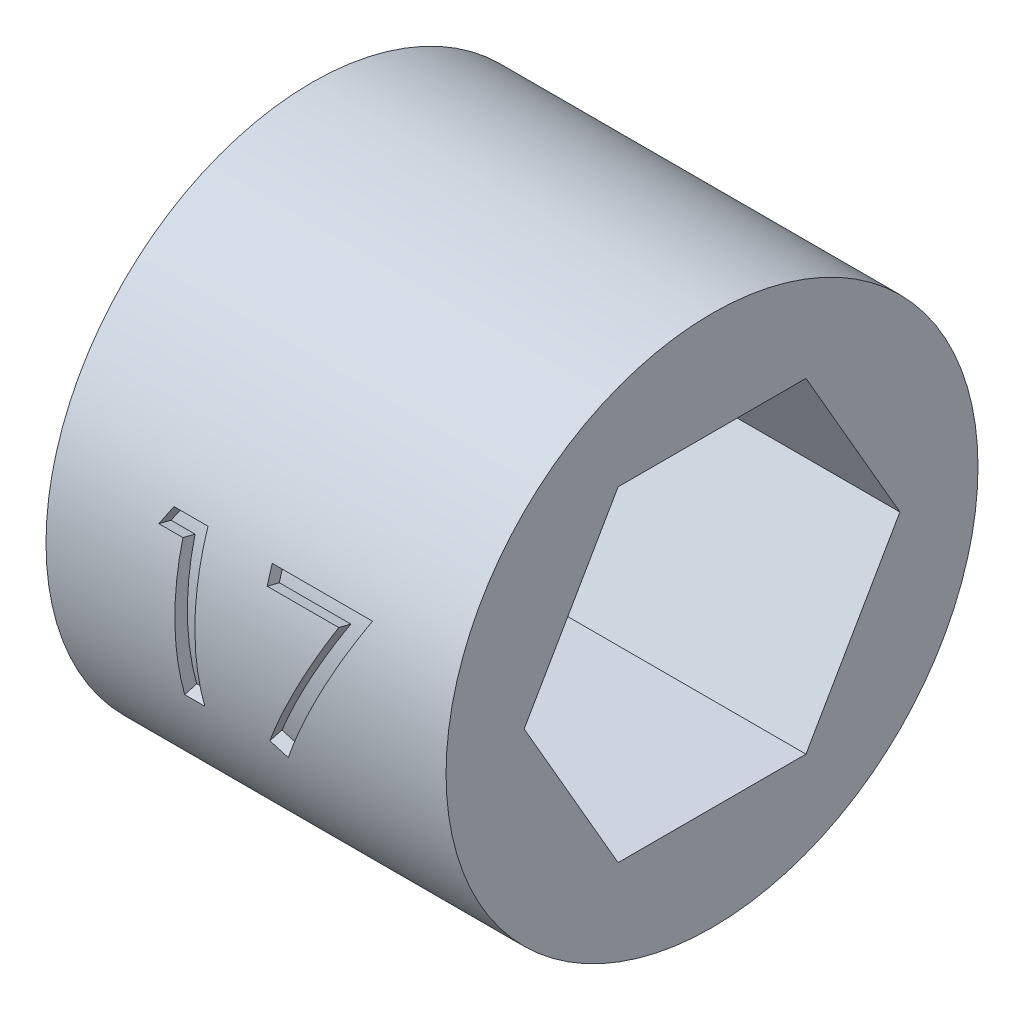
ISO-10303-21;
HEADER;
FILE_DESCRIPTION(('STEP AP214'),'2;1');
FILE_NAME('part.step','',(''),(''),'','','');
FILE_SCHEMA(('AUTOMOTIVE_DESIGN { 1 0 10303 214 1 1 1 1 }'));
ENDSEC;
DATA;
#1=APPLICATION_CONTEXT('core data for automotive mechanical design processes');
#2=APPLICATION_PROTOCOL_DEFINITION('international standard','automotive_design',2000,#1);
#3=PRODUCT_CONTEXT('',#1,'mechanical');
#4=PRODUCT('Part','Part','',(#3));
#5=PRODUCT_RELATED_PRODUCT_CATEGORY('part','',(#4));
#6=PRODUCT_DEFINITION_FORMATION('','',#4);
#7=PRODUCT_DEFINITION_CONTEXT('part definition',#1,'design');
#8=PRODUCT_DEFINITION('design','',#6,#7);
#9=PRODUCT_DEFINITION_SHAPE('','',#8);
#10=(LENGTH_UNIT() NAMED_UNIT(*) SI_UNIT(.MILLI.,.METRE.));
#11=(NAMED_UNIT(*) PLANE_ANGLE_UNIT() SI_UNIT($,.RADIAN.));
#12=(NAMED_UNIT(*) SI_UNIT($,.STERADIAN.) SOLID_ANGLE_UNIT());
#13=UNCERTAINTY_MEASURE_WITH_UNIT(LENGTH_MEASURE(1.E-05),#10,'distance_accuracy_value','');
#14=(GEOMETRIC_REPRESENTATION_CONTEXT(3) GLOBAL_UNCERTAINTY_ASSIGNED_CONTEXT((#13)) GLOBAL_UNIT_ASSIGNED_CONTEXT((#10,
#11,#12)) REPRESENTATION_CONTEXT('',''));
#15=CARTESIAN_POINT('',(0.,0.,0.));
#16=DIRECTION('',(0.,0.,1.));
#17=DIRECTION('',(1.,0.,0.));
#18=AXIS2_PLACEMENT_3D('',#15,#16,#17);
#19=CARTESIAN_POINT('',(16.23749991,0.,0.));
#20=DIRECTION('',(1.,0.,0.));
#21=DIRECTION('',(0.,0.,-1.));
#22=AXIS2_PLACEMENT_3D('',#19,#20,#21);
#23=PLANE('',#22);
#24=CARTESIAN_POINT('',(16.23749991,0.,0.));
#25=DIRECTION('',(1.,0.,0.));
#26=DIRECTION('',(0.,0.,-1.));
#27=AXIS2_PLACEMENT_3D('',#24,#25,#26);
#28=CIRCLE('',#27,10.795);
#29=CARTESIAN_POINT('',(16.23749991,0.,-10.795));
#30=VERTEX_POINT('',#29);
#31=EDGE_CURVE('E13',#30,#30,#28,.T.);
#32=ORIENTED_EDGE('',*,*,#31,.T.);
#33=EDGE_LOOP('',(#32));
#34=FACE_BOUND('',#33,.T.);
#35=DIRECTION('',(0.,0.866025403784438,0.500000000000001));
#36=VECTOR('',#35,1.);
#37=CARTESIAN_POINT('',(16.23749991,0.,-7.62564235545655));
#38=LINE('',#37,#36);
#39=CARTESIAN_POINT('',(16.23749991,0.,-7.62564235545655));
#40=VERTEX_POINT('',#39);
#41=CARTESIAN_POINT('',(16.23749991,6.60399999999998,-3.81282117772826));
#42=VERTEX_POINT('',#41);
#43=EDGE_CURVE('E691',#40,#42,#38,.T.);
#44=ORIENTED_EDGE('',*,*,#43,.F.);
#45=DIRECTION('',(0.,0.866025403784441,-0.499999999999995));
#46=VECTOR('',#45,1.);
#47=CARTESIAN_POINT('',(16.23749991,-6.60399999999993,-3.81282117772835));
#48=LINE('',#47,#46);
#49=CARTESIAN_POINT('',(16.23749991,-6.60399999999993,-3.81282117772835));
#50=VERTEX_POINT('',#49);
#51=EDGE_CURVE('E668',#50,#40,#48,.T.);
#52=ORIENTED_EDGE('',*,*,#51,.F.);
#53=DIRECTION('',(0.,0.,-1.));
#54=VECTOR('',#53,1.);
#55=CARTESIAN_POINT('',(16.23749991,-6.60400000000001,3.81282117772821));
#56=LINE('',#55,#54);
#57=CARTESIAN_POINT('',(16.23749991,-6.60400000000001,3.81282117772821));
#58=VERTEX_POINT('',#57);
#59=EDGE_CURVE('E664',#58,#50,#56,.T.);
#60=ORIENTED_EDGE('',*,*,#59,.F.);
#61=DIRECTION('',(0.,-0.866025403784435,-0.500000000000007));
#62=VECTOR('',#61,1.);
#63=CARTESIAN_POINT('',(16.23749991,0.,7.62564235545655));
#64=LINE('',#63,#62);
#65=CARTESIAN_POINT('',(16.23749991,0.,7.62564235545655));
#66=VERTEX_POINT('',#65);
#67=EDGE_CURVE('E684',#66,#58,#64,.T.);
#68=ORIENTED_EDGE('',*,*,#67,.F.);
#69=DIRECTION('',(0.,-0.866025403784441,0.499999999999995));
#70=VECTOR('',#69,1.);
#71=CARTESIAN_POINT('',(16.23749991,6.60399999999996,3.8128211777283));
#72=LINE('',#71,#70);
#73=CARTESIAN_POINT('',(16.23749991,6.60399999999996,3.8128211777283));
#74=VERTEX_POINT('',#73);
#75=EDGE_CURVE('E687',#74,#66,#72,.T.);
#76=ORIENTED_EDGE('',*,*,#75,.F.);
#77=DIRECTION('',(0.,0.,1.));
#78=VECTOR('',#77,1.);
#79=CARTESIAN_POINT('',(16.23749991,6.60399999999998,-3.81282117772826));
#80=LINE('',#79,#78);
#81=EDGE_CURVE('E689',#42,#74,#80,.T.);
#82=ORIENTED_EDGE('',*,*,#81,.F.);
#83=EDGE_LOOP('',(#44,#52,#60,#68,#76,#82));
#84=FACE_BOUND('',#83,.T.);
#85=ADVANCED_FACE('F363',(#34,#84),#23,.T.);
#86=CARTESIAN_POINT('',(0.,0.,0.));
#87=DIRECTION('',(1.,0.,0.));
#88=DIRECTION('',(0.,0.,-1.));
#89=AXIS2_PLACEMENT_3D('',#86,#87,#88);
#90=PLANE('',#89);
#91=CARTESIAN_POINT('',(0.,0.,0.));
#92=DIRECTION('',(1.,0.,0.));
#93=DIRECTION('',(0.,0.,-1.));
#94=AXIS2_PLACEMENT_3D('',#91,#92,#93);
#95=CIRCLE('',#94,10.795);
#96=CARTESIAN_POINT('',(0.,0.,-10.795));
#97=VERTEX_POINT('',#96);
#98=EDGE_CURVE('E374',#97,#97,#95,.T.);
#99=ORIENTED_EDGE('',*,*,#98,.F.);
#100=EDGE_LOOP('',(#99));
#101=FACE_BOUND('',#100,.T.);
#102=DIRECTION('',(0.,0.866025403784441,-0.499999999999995));
#103=VECTOR('',#102,1.);
#104=CARTESIAN_POINT('',(0.,-6.60399999999993,-3.81282117772835));
#105=LINE('',#104,#103);
#106=CARTESIAN_POINT('',(0.,-6.60399999999993,-3.81282117772835));
#107=VERTEX_POINT('',#106);
#108=CARTESIAN_POINT('',(0.,0.,-7.62564235545655));
#109=VERTEX_POINT('',#108);
#110=EDGE_CURVE('E509',#107,#109,#105,.T.);
#111=ORIENTED_EDGE('',*,*,#110,.T.);
#112=DIRECTION('',(0.,0.866025403784438,0.500000000000001));
#113=VECTOR('',#112,1.);
#114=CARTESIAN_POINT('',(0.,0.,-7.62564235545655));
#115=LINE('',#114,#113);
#116=CARTESIAN_POINT('',(0.,6.60399999999998,-3.81282117772826));
#117=VERTEX_POINT('',#116);
#118=EDGE_CURVE('E678',#109,#117,#115,.T.);
#119=ORIENTED_EDGE('',*,*,#118,.T.);
#120=DIRECTION('',(0.,0.,1.));
#121=VECTOR('',#120,1.);
#122=CARTESIAN_POINT('',(0.,6.60399999999998,-3.81282117772826));
#123=LINE('',#122,#121);
#124=CARTESIAN_POINT('',(0.,6.60399999999996,3.8128211777283));
#125=VERTEX_POINT('',#124);
#126=EDGE_CURVE('E675',#117,#125,#123,.T.);
#127=ORIENTED_EDGE('',*,*,#126,.T.);
#128=DIRECTION('',(0.,-0.866025403784441,0.499999999999995));
#129=VECTOR('',#128,1.);
#130=CARTESIAN_POINT('',(0.,6.60399999999996,3.8128211777283));
#131=LINE('',#130,#129);
#132=CARTESIAN_POINT('',(0.,0.,7.62564235545655));
#133=VERTEX_POINT('',#132);
#134=EDGE_CURVE('E672',#125,#133,#131,.T.);
#135=ORIENTED_EDGE('',*,*,#134,.T.);
#136=DIRECTION('',(0.,-0.866025403784435,-0.500000000000007));
#137=VECTOR('',#136,1.);
#138=CARTESIAN_POINT('',(0.,0.,7.62564235545655));
#139=LINE('',#138,#137);
#140=CARTESIAN_POINT('',(0.,-6.60400000000001,3.81282117772821));
#141=VERTEX_POINT('',#140);
#142=EDGE_CURVE('E669',#133,#141,#139,.T.);
#143=ORIENTED_EDGE('',*,*,#142,.T.);
#144=DIRECTION('',(0.,0.,-1.));
#145=VECTOR('',#144,1.);
#146=CARTESIAN_POINT('',(0.,-6.60400000000001,3.81282117772821));
#147=LINE('',#146,#145);
#148=EDGE_CURVE('E665',#141,#107,#147,.T.);
#149=ORIENTED_EDGE('',*,*,#148,.T.);
#150=EDGE_LOOP('',(#111,#119,#127,#135,#143,#149));
#151=FACE_BOUND('',#150,.T.);
#152=ADVANCED_FACE('F1330',(#101,#151),#90,.F.);
#153=CARTESIAN_POINT('',(16.23749991,0.,0.));
#154=DIRECTION('',(-1.,0.,0.));
#155=DIRECTION('',(0.,0.,1.));
#156=AXIS2_PLACEMENT_3D('',#153,#154,#155);
#157=CYLINDRICAL_SURFACE('',#156,10.795);
#158=CARTESIAN_POINT('',(6.04317977266915,3.34799785215524,10.2626963017505));
#159=CARTESIAN_POINT('',(5.58270563876344,3.34798552404855,10.2627003235469));
#160=CARTESIAN_POINT('',(5.12223150485772,3.34797319593462,10.262704345321));
#161=CARTESIAN_POINT('',(4.66175737095201,3.34796086781344,10.262708367073));
#162=B_SPLINE_CURVE_WITH_KNOTS('',3,(#158,#159,#160,#161),.UNSPECIFIED.,.F.,.F.,(4,4),(0.,
0.99999963804209),.UNSPECIFIED.);
#163=CARTESIAN_POINT('',(6.04317977266915,3.34799785215524,10.2626963017505));
#164=VERTEX_POINT('',#163);
#165=CARTESIAN_POINT('',(4.66175687093506,3.34796086780005,10.2627083670774));
#166=VERTEX_POINT('',#165);
#167=EDGE_CURVE('E527',#164,#166,#162,.T.);
#168=ORIENTED_EDGE('',*,*,#167,.F.);
#169=CARTESIAN_POINT('',(6.04317167885554,-2.91281495669229,10.3945915758182));
#170=CARTESIAN_POINT('',(6.04317167885554,-1.37194914945548,10.8263792931938));
#171=CARTESIAN_POINT('',(6.04317167885554,0.227365625654538,10.7926053329245));
#172=CARTESIAN_POINT('',(6.04317167885554,1.82721819927044,10.7588200155505));
#173=CARTESIAN_POINT('',(6.04317167885554,3.34799784702387,10.2626963034245));
#174=B_SPLINE_CURVE_WITH_KNOTS('',2,(#169,#170,#171,#172,#173),.UNSPECIFIED.,.F.,.F.,(3,2,3),
(0.,0.5,1.),.UNSPECIFIED.);
#175=CARTESIAN_POINT('',(6.04317167885554,-2.91281495669229,10.3945915758182));
#176=VERTEX_POINT('',#175);
#177=EDGE_CURVE('E499',#176,#164,#174,.T.);
#178=ORIENTED_EDGE('',*,*,#177,.F.);
#179=CARTESIAN_POINT('',(5.22907354558086,-2.91281746579775,10.3945908727057));
#180=DIRECTION('',(1.,0.,0.));
#181=VECTOR('',#180,1.);
#182=LINE('',#179,#181);
#183=CARTESIAN_POINT('',(5.22907354558086,-2.91281746579783,10.394590872706));
#184=VERTEX_POINT('',#183);
#185=EDGE_CURVE('E514',#184,#176,#182,.T.);
#186=ORIENTED_EDGE('',*,*,#185,.F.);
#187=CARTESIAN_POINT('',(5.22907291263783,2.64334490864245,10.4663629162166));
#188=CARTESIAN_POINT('',(5.22907291263783,1.27313266161265,10.8124185227286));
#189=CARTESIAN_POINT('',(5.22907291263783,-0.139434696625619,10.7940994513381));
#190=CARTESIAN_POINT('',(5.22907291263783,-1.55254258674846,10.7757733699865));
#191=CARTESIAN_POINT('',(5.22907291263783,-2.91281997490012,10.3945901695941));
#192=B_SPLINE_CURVE_WITH_KNOTS('',2,(#187,#188,#189,#190,#191),.UNSPECIFIED.,.F.,.F.,(3,2,3),
(0.,0.5,1.),.UNSPECIFIED.);
#193=CARTESIAN_POINT('',(5.22907291263783,2.64334490864245,10.4663629162166));
#194=VERTEX_POINT('',#193);
#195=EDGE_CURVE('E382',#194,#184,#192,.T.);
#196=ORIENTED_EDGE('',*,*,#195,.F.);
#197=CARTESIAN_POINT('',(4.25214056682369,2.64336604069233,10.4663575791636));
#198=CARTESIAN_POINT('',(4.57778451542839,2.6433589966811,10.4663593581874));
#199=CARTESIAN_POINT('',(4.90342846403312,2.64335195266808,10.4663611372042));
#200=CARTESIAN_POINT('',(5.22907241263783,2.64334490865326,10.4663629162139));
#201=B_SPLINE_CURVE_WITH_KNOTS('',3,(#197,#198,#199,#200),.UNSPECIFIED.,.F.,.F.,(4,4),(0.,
0.999999488193832),.UNSPECIFIED.);
#202=CARTESIAN_POINT('',(4.25214056682369,2.64336604069233,10.4663575791636));
#203=VERTEX_POINT('',#202);
#204=EDGE_CURVE('E561',#203,#194,#201,.T.);
#205=ORIENTED_EDGE('',*,*,#204,.F.);
#206=CARTESIAN_POINT('',(4.66175687093506,3.34796086780005,10.2627083670774));
#207=CARTESIAN_POINT('',(4.52521803608222,3.11549270364724,10.3385454939599));
#208=CARTESIAN_POINT('',(4.38867940469037,2.88044721830809,10.406480747097));
#209=CARTESIAN_POINT('',(4.25214056983753,2.64336604592545,10.4663575778419));
#210=B_SPLINE_CURVE_WITH_KNOTS('',3,(#206,#207,#208,#209),.UNSPECIFIED.,.F.,.F.,(4,4),(0.,
0.999999992642285),.UNSPECIFIED.);
#211=EDGE_CURVE('E550',#166,#203,#210,.T.);
#212=ORIENTED_EDGE('',*,*,#211,.F.);
#213=EDGE_LOOP('',(#168,#178,#186,#196,#205,#212));
#214=FACE_BOUND('',#213,.T.);
#215=CARTESIAN_POINT('',(12.7188692113992,3.34773164853551,10.2627831414969));
#216=CARTESIAN_POINT('',(11.3620143481652,3.34778988783628,10.2627641437701));
#217=CARTESIAN_POINT('',(10.0051594849311,3.34784812697534,10.2627451455476));
#218=CARTESIAN_POINT('',(8.648304621697,3.34790636595268,10.2627261468293));
#219=B_SPLINE_CURVE_WITH_KNOTS('',3,(#215,#216,#217,#218),.UNSPECIFIED.,.F.,.F.,(4,4),(0.,
0.999999877166931),.UNSPECIFIED.);
#220=CARTESIAN_POINT('',(12.7188692113992,3.34773164853551,10.2627831414969));
#221=VERTEX_POINT('',#220);
#222=CARTESIAN_POINT('',(8.648304121697,3.34790636597414,10.2627261468223));
#223=VERTEX_POINT('',#222);
#224=EDGE_CURVE('E604',#221,#223,#219,.T.);
#225=ORIENTED_EDGE('',*,*,#224,.F.);
#226=CARTESIAN_POINT('',(9.38861175680499,-3.06951937423919,10.349399780237));
#227=CARTESIAN_POINT('',(9.94368245447618,-2.02824426737205,10.6582306479503));
#228=CARTESIAN_POINT('',(10.4986975740836,-0.940262710048668,10.8086744459333));
#229=CARTESIAN_POINT('',(11.6087833913622,1.23164649225113,10.7793591720568));
#230=CARTESIAN_POINT('',(12.1637985109696,2.31517122047358,10.5996055385531));
#231=CARTESIAN_POINT('',(12.7188692086408,3.34773164340419,10.2627831431708));
#232=B_SPLINE_CURVE_WITH_KNOTS('',3,(#226,#227,#228,#229,#230,#231),.UNSPECIFIED.,.F.,.F.,(4,2,
4),(0.,0.499999999585854,0.999999999171707),.UNSPECIFIED.);
#233=CARTESIAN_POINT('',(9.38861175680499,-3.06951937423919,10.349399780237));
#234=VERTEX_POINT('',#233);
#235=EDGE_CURVE('E592',#234,#221,#232,.T.);
#236=ORIENTED_EDGE('',*,*,#235,.F.);
#237=CARTESIAN_POINT('',(8.72715726647285,-2.76412553020915,10.4351154786732));
#238=CARTESIAN_POINT('',(8.94764196366597,-2.86633587797326,10.4080412951356));
#239=CARTESIAN_POINT('',(9.16812665802683,-2.96814841335958,10.379465302359));
#240=CARTESIAN_POINT('',(9.38861135521994,-3.06951918960511,10.3493998349975));
#241=B_SPLINE_CURVE_WITH_KNOTS('',3,(#237,#238,#239,#240),.UNSPECIFIED.,.F.,.F.,(4,4),(0.,
0.999999392875771),.UNSPECIFIED.);
#242=CARTESIAN_POINT('',(8.72715726647285,-2.76412553020915,10.4351154786732));
#243=VERTEX_POINT('',#242);
#244=EDGE_CURVE('E647',#243,#234,#241,.T.);
#245=ORIENTED_EDGE('',*,*,#244,.F.);
#246=CARTESIAN_POINT('',(11.5536532848592,2.6433567003582,10.4663599381385));
#247=CARTESIAN_POINT('',(11.0825589799586,1.76010625995397,10.6894313768753));
#248=CARTESIAN_POINT('',(10.6114879453971,0.848573968369783,10.8000832605272));
#249=CARTESIAN_POINT('',(9.66932260593498,-0.973319014407072,10.7895563537297));
#250=CARTESIAN_POINT('',(9.19825157137352,-1.8835117927987,10.6683785334812));
#251=CARTESIAN_POINT('',(8.72715726647285,-2.76412553020914,10.4351154786732));
#252=B_SPLINE_CURVE_WITH_KNOTS('',3,(#246,#247,#248,#249,#250,#251),.UNSPECIFIED.,.F.,.F.,(4,2,
4),(0.,0.5,1.),.UNSPECIFIED.);
#253=CARTESIAN_POINT('',(11.5536532848592,2.6433567003582,10.4663599381385));
#254=VERTEX_POINT('',#253);
#255=EDGE_CURVE('E391',#254,#243,#252,.T.);
#256=ORIENTED_EDGE('',*,*,#255,.F.);
#257=CARTESIAN_POINT('',(8.64830637185267,2.64335784741836,10.4663596484399));
#258=DIRECTION('',(1.,0.,0.));
#259=VECTOR('',#258,1.);
#260=LINE('',#257,#259);
#261=CARTESIAN_POINT('',(8.64830637185267,2.64335899447812,10.4663593587413));
#262=VERTEX_POINT('',#261);
#263=EDGE_CURVE('E627',#262,#254,#260,.T.);
#264=ORIENTED_EDGE('',*,*,#263,.F.);
#265=CARTESIAN_POINT('',(8.648304121697,3.34790636597414,10.2627261468223));
#266=CARTESIAN_POINT('',(8.648304121697,2.9990932610284,10.3765159525597));
#267=CARTESIAN_POINT('',(8.648304121697,2.6433589997113,10.4663593574196));
#268=B_SPLINE_CURVE_WITH_KNOTS('',2,(#265,#266,#267),.UNSPECIFIED.,.F.,.F.,(3,3),(0.,1.),.UNSPECIFIED.);
#269=EDGE_CURVE('E616',#223,#262,#268,.T.);
#270=ORIENTED_EDGE('',*,*,#269,.F.);
#271=EDGE_LOOP('',(#225,#236,#245,#256,#264,#270));
#272=FACE_BOUND('',#271,.T.);
#273=ORIENTED_EDGE('',*,*,#31,.F.);
#274=EDGE_LOOP('',(#273));
#275=FACE_BOUND('',#274,.T.);
#276=ORIENTED_EDGE('',*,*,#98,.T.);
#277=EDGE_LOOP('',(#276));
#278=FACE_BOUND('',#277,.T.);
#279=ADVANCED_FACE('F365',(#214,#272,#275,#278),#157,.T.);
#280=CARTESIAN_POINT('',(16.23749991,-6.60399999999993,-3.81282117772835));
#281=DIRECTION('',(0.,0.499999999999995,0.866025403784441));
#282=DIRECTION('',(0.,-0.866025403784441,0.499999999999995));
#283=AXIS2_PLACEMENT_3D('',#280,#281,#282);
#284=PLANE('',#283);
#285=ORIENTED_EDGE('',*,*,#110,.F.);
#286=DIRECTION('',(-1.,0.,0.));
#287=VECTOR('',#286,1.);
#288=CARTESIAN_POINT('',(16.23749991,-6.60399999999993,-3.81282117772835));
#289=LINE('',#288,#287);
#290=EDGE_CURVE('E661',#50,#107,#289,.T.);
#291=ORIENTED_EDGE('',*,*,#290,.F.);
#292=ORIENTED_EDGE('',*,*,#51,.T.);
#293=DIRECTION('',(-1.,0.,0.));
#294=VECTOR('',#293,1.);
#295=CARTESIAN_POINT('',(16.23749991,0.,-7.62564235545655));
#296=LINE('',#295,#294);
#297=EDGE_CURVE('E649',#40,#109,#296,.T.);
#298=ORIENTED_EDGE('',*,*,#297,.T.);
#299=EDGE_LOOP('',(#285,#291,#292,#298));
#300=FACE_BOUND('',#299,.T.);
#301=ADVANCED_FACE('F1339',(#300),#284,.T.);
#302=CARTESIAN_POINT('',(16.23749991,0.,-7.62564235545655));
#303=DIRECTION('',(0.,-0.500000000000001,0.866025403784438));
#304=DIRECTION('',(0.,-0.866025403784438,-0.500000000000001));
#305=AXIS2_PLACEMENT_3D('',#302,#303,#304);
#306=PLANE('',#305);
#307=ORIENTED_EDGE('',*,*,#118,.F.);
#308=ORIENTED_EDGE('',*,*,#297,.F.);
#309=ORIENTED_EDGE('',*,*,#43,.T.);
#310=DIRECTION('',(-1.,0.,0.));
#311=VECTOR('',#310,1.);
#312=CARTESIAN_POINT('',(16.23749991,6.60399999999998,-3.81282117772826));
#313=LINE('',#312,#311);
#314=EDGE_CURVE('E653',#42,#117,#313,.T.);
#315=ORIENTED_EDGE('',*,*,#314,.T.);
#316=EDGE_LOOP('',(#307,#308,#309,#315));
#317=FACE_BOUND('',#316,.T.);
#318=ADVANCED_FACE('F1342',(#317),#306,.T.);
#319=CARTESIAN_POINT('',(16.23749991,6.60399999999998,-3.81282117772826));
#320=DIRECTION('',(0.,-1.,0.));
#321=DIRECTION('',(0.,0.,-1.));
#322=AXIS2_PLACEMENT_3D('',#319,#320,#321);
#323=PLANE('',#322);
#324=ORIENTED_EDGE('',*,*,#126,.F.);
#325=ORIENTED_EDGE('',*,*,#314,.F.);
#326=ORIENTED_EDGE('',*,*,#81,.T.);
#327=DIRECTION('',(-1.,0.,0.));
#328=VECTOR('',#327,1.);
#329=CARTESIAN_POINT('',(16.23749991,6.60399999999996,3.8128211777283));
#330=LINE('',#329,#328);
#331=EDGE_CURVE('E655',#74,#125,#330,.T.);
#332=ORIENTED_EDGE('',*,*,#331,.T.);
#333=EDGE_LOOP('',(#324,#325,#326,#332));
#334=FACE_BOUND('',#333,.T.);
#335=ADVANCED_FACE('F1346',(#334),#323,.T.);
#336=CARTESIAN_POINT('',(16.23749991,6.60399999999996,3.8128211777283));
#337=DIRECTION('',(0.,-0.499999999999995,-0.866025403784442));
#338=DIRECTION('',(0.,0.866025403784441,-0.499999999999995));
#339=AXIS2_PLACEMENT_3D('',#336,#337,#338);
#340=PLANE('',#339);
#341=ORIENTED_EDGE('',*,*,#134,.F.);
#342=ORIENTED_EDGE('',*,*,#331,.F.);
#343=ORIENTED_EDGE('',*,*,#75,.T.);
#344=DIRECTION('',(-1.,0.,0.));
#345=VECTOR('',#344,1.);
#346=CARTESIAN_POINT('',(16.23749991,0.,7.62564235545655));
#347=LINE('',#346,#345);
#348=EDGE_CURVE('E657',#66,#133,#347,.T.);
#349=ORIENTED_EDGE('',*,*,#348,.T.);
#350=EDGE_LOOP('',(#341,#342,#343,#349));
#351=FACE_BOUND('',#350,.T.);
#352=ADVANCED_FACE('F1350',(#351),#340,.T.);
#353=CARTESIAN_POINT('',(16.23749991,0.,7.62564235545655));
#354=DIRECTION('',(0.,0.500000000000007,-0.866025403784435));
#355=DIRECTION('',(0.,0.866025403784435,0.500000000000007));
#356=AXIS2_PLACEMENT_3D('',#353,#354,#355);
#357=PLANE('',#356);
#358=ORIENTED_EDGE('',*,*,#142,.F.);
#359=ORIENTED_EDGE('',*,*,#348,.F.);
#360=ORIENTED_EDGE('',*,*,#67,.T.);
#361=DIRECTION('',(-1.,0.,0.));
#362=VECTOR('',#361,1.);
#363=CARTESIAN_POINT('',(16.23749991,-6.60400000000001,3.81282117772821));
#364=LINE('',#363,#362);
#365=EDGE_CURVE('E659',#58,#141,#364,.T.);
#366=ORIENTED_EDGE('',*,*,#365,.T.);
#367=EDGE_LOOP('',(#358,#359,#360,#366));
#368=FACE_BOUND('',#367,.T.);
#369=ADVANCED_FACE('F1327',(#368),#357,.T.);
#370=CARTESIAN_POINT('',(16.23749991,-6.60400000000001,3.81282117772821));
#371=DIRECTION('',(0.,1.,0.));
#372=DIRECTION('',(0.,0.,1.));
#373=AXIS2_PLACEMENT_3D('',#370,#371,#372);
#374=PLANE('',#373);
#375=ORIENTED_EDGE('',*,*,#148,.F.);
#376=ORIENTED_EDGE('',*,*,#365,.F.);
#377=ORIENTED_EDGE('',*,*,#59,.T.);
#378=ORIENTED_EDGE('',*,*,#290,.T.);
#379=EDGE_LOOP('',(#375,#376,#377,#378));
#380=FACE_BOUND('',#379,.T.);
#381=ADVANCED_FACE('F719',(#380),#374,.T.);
#382=CARTESIAN_POINT('',(9.38861175680499,-3.06951937423919,10.349399780237));
#383=CARTESIAN_POINT('',(9.94368245447618,-2.02824426737205,10.6582306479503));
#384=CARTESIAN_POINT('',(10.4986975740836,-0.940262710048668,10.8086744459333));
#385=CARTESIAN_POINT('',(11.6087833913622,1.23164649225113,10.7793591720568));
#386=CARTESIAN_POINT('',(12.1637985109696,2.31517122047358,10.5996055385531));
#387=CARTESIAN_POINT('',(12.7188692086408,3.34773164340419,10.2627831431708));
#388=CARTESIAN_POINT('',(9.38861175680499,-2.92507140368676,9.86236920234352));
#389=CARTESIAN_POINT('',(9.9436818840039,-1.93279849812586,10.156666550289));
#390=CARTESIAN_POINT('',(10.4986975740836,-0.896015053105201,10.3000309425952));
#391=CARTESIAN_POINT('',(11.6087833913622,1.17368665732167,10.2720952110188));
#392=CARTESIAN_POINT('',(12.1637990814419,2.20622299784054,10.100800242155));
#393=CARTESIAN_POINT('',(12.7188692086408,3.1901913307734,9.77982864231568));
#394=B_SPLINE_SURFACE_WITH_KNOTS('',1,3,((#382,#383,#384,#385,#386,#387),(#388,#389,#390,#391,
#392,#393)),.UNSPECIFIED.,.F.,.F.,.F.,(2,2),(4,2,4),(0.,1.),(0.,0.499999999585854,
0.999999999171707),.UNSPECIFIED.);
#395=CARTESIAN_POINT('',(9.38861175680499,-2.92507140368676,9.86236920234352));
#396=CARTESIAN_POINT('',(9.38861175680499,-3.06951937423919,10.349399780237));
#397=B_SPLINE_CURVE_WITH_KNOTS('',1,(#395,#396),.UNSPECIFIED.,.F.,.F.,(2,2),(0.,1.),.UNSPECIFIED.);
#398=CARTESIAN_POINT('',(9.38861175680499,-2.92507140368676,9.86236920234352));
#399=VERTEX_POINT('',#398);
#400=EDGE_CURVE('E752',#399,#234,#397,.T.);
#401=CARTESIAN_POINT('',(12.7188692113992,3.19019133566325,9.77982864072061));
#402=CARTESIAN_POINT('',(12.7188692113992,3.34773164853551,10.2627831414969));
#403=B_SPLINE_CURVE_WITH_KNOTS('',1,(#401,#402),.UNSPECIFIED.,.F.,.F.,(2,2),(0.,1.),.UNSPECIFIED.);
#404=CARTESIAN_POINT('',(12.7188692113992,3.19019133566325,9.77982864072061));
#405=VERTEX_POINT('',#404);
#406=EDGE_CURVE('E1281',#405,#221,#403,.T.);
#407=CARTESIAN_POINT('',(12.7188692086408,3.1901913307734,9.77982864231568));
#408=CARTESIAN_POINT('',(12.1637990814419,2.20622299784054,10.100800242155));
#409=CARTESIAN_POINT('',(11.6087833913622,1.17368665732167,10.2720952110188));
#410=CARTESIAN_POINT('',(10.4986975740836,-0.896015053105201,10.3000309425952));
#411=CARTESIAN_POINT('',(9.9436818840039,-1.93279849812586,10.156666550289));
#412=CARTESIAN_POINT('',(9.38861175680499,-2.92507140368676,9.86236920234352));
#413=B_SPLINE_CURVE_WITH_KNOTS('',3,(#407,#408,#409,#410,#411,#412),.UNSPECIFIED.,.F.,.F.,(4,2,
4),(0.,0.499999999585854,0.999999999171707),.UNSPECIFIED.);
#414=EDGE_CURVE('E882',#399,#405,#413,.F.);
#415=ORIENTED_EDGE('',*,*,#400,.T.);
#416=ORIENTED_EDGE('',*,*,#235,.T.);
#417=ORIENTED_EDGE('',*,*,#406,.F.);
#418=ORIENTED_EDGE('',*,*,#414,.F.);
#419=EDGE_LOOP('',(#415,#416,#417,#418));
#420=FACE_BOUND('',#419,.T.);
#421=ADVANCED_FACE('F714',(#420),#394,.F.);
#422=CARTESIAN_POINT('',(12.7188692113992,3.34773164853551,10.2627831414969));
#423=CARTESIAN_POINT('',(11.3620143481652,3.34778988783628,10.2627641437701));
#424=CARTESIAN_POINT('',(10.0051594849311,3.34784812697534,10.2627451455476));
#425=CARTESIAN_POINT('',(8.648304621697,3.34790636595268,10.2627261468293));
#426=CARTESIAN_POINT('',(12.7188692113992,3.19019133566325,9.77982864072061));
#427=CARTESIAN_POINT('',(11.3620143481651,3.19024683429104,9.77981053700448));
#428=CARTESIAN_POINT('',(10.0051594849311,3.19030233276474,9.77979243281593));
#429=CARTESIAN_POINT('',(8.648304621697,3.19035783108432,9.77977432815497));
#430=B_SPLINE_SURFACE_WITH_KNOTS('',1,3,((#422,#423,#424,#425),(#426,#427,#428,#429)),
.UNSPECIFIED.,.F.,.F.,.F.,(2,2),(4,4),(0.,1.),(0.,0.999999877166931),.UNSPECIFIED.);
#431=CARTESIAN_POINT('',(8.648304621697,3.34790636595268,10.2627261468293));
#432=CARTESIAN_POINT('',(8.648304621697,3.19035783108432,9.77977432815497));
#433=B_SPLINE_CURVE_WITH_KNOTS('',1,(#431,#432),.UNSPECIFIED.,.F.,.F.,(2,2),(0.,1.),.UNSPECIFIED.);
#434=CARTESIAN_POINT('',(8.648304121697,3.19035783110477,9.77977432814829));
#435=VERTEX_POINT('',#434);
#436=EDGE_CURVE('E1260',#435,#223,#433,.F.);
#437=CARTESIAN_POINT('',(8.648304621697,3.19035783108432,9.77977432815497));
#438=CARTESIAN_POINT('',(10.0051594849311,3.19030233276474,9.77979243281593));
#439=CARTESIAN_POINT('',(11.3620143481651,3.19024683429104,9.77981053700448));
#440=CARTESIAN_POINT('',(12.7188692113992,3.19019133566325,9.77982864072061));
#441=B_SPLINE_CURVE_WITH_KNOTS('',3,(#437,#438,#439,#440),.UNSPECIFIED.,.F.,.F.,(4,4),(0.,
0.999999877166931),.UNSPECIFIED.);
#442=EDGE_CURVE('E862',#405,#435,#441,.F.);
#443=ORIENTED_EDGE('',*,*,#406,.T.);
#444=ORIENTED_EDGE('',*,*,#224,.T.);
#445=ORIENTED_EDGE('',*,*,#436,.F.);
#446=ORIENTED_EDGE('',*,*,#442,.F.);
#447=EDGE_LOOP('',(#443,#444,#445,#446));
#448=FACE_BOUND('',#447,.T.);
#449=ADVANCED_FACE('F827',(#448),#430,.F.);
#450=CARTESIAN_POINT('',(8.648304121697,0.,0.));
#451=DIRECTION('',(1.,0.,0.));
#452=DIRECTION('',(0.,0.,-1.));
#453=AXIS2_PLACEMENT_3D('',#450,#451,#452);
#454=PLANE('',#453);
#455=ORIENTED_EDGE('',*,*,#436,.T.);
#456=ORIENTED_EDGE('',*,*,#269,.T.);
#457=CARTESIAN_POINT('',(8.64830637185267,2.51896453695161,9.97382507674858));
#458=DIRECTION('',(0.,0.244868721391234,0.969556243486793));
#459=VECTOR('',#458,1.);
#460=LINE('',#457,#459);
#461=CARTESIAN_POINT('',(8.64830637185267,2.5189656300321,9.97382480068289));
#462=VERTEX_POINT('',#461);
#463=EDGE_CURVE('E813',#462,#262,#460,.T.);
#464=ORIENTED_EDGE('',*,*,#463,.F.);
#465=CARTESIAN_POINT('',(8.648304121697,3.19035783110477,9.77977432814829));
#466=CARTESIAN_POINT('',(8.64830421545349,3.1626686266324,9.78880710337538));
#467=CARTESIAN_POINT('',(8.64830430920997,3.13494105889505,9.7977222790799));
#468=CARTESIAN_POINT('',(8.64830449672294,3.07941120153248,9.81531680167755));
#469=CARTESIAN_POINT('',(8.64830459047943,3.05160891190726,9.82399614857068));
#470=CARTESIAN_POINT('',(8.6483047779924,2.995931615411,9.84111838377932));
#471=CARTESIAN_POINT('',(8.64830487174889,2.96805660853998,9.84956127209482));
#472=CARTESIAN_POINT('',(8.64830505926186,2.91223588889058,9.86620998202207));
#473=CARTESIAN_POINT('',(8.64830515301835,2.88429017611221,9.87441580363383));
#474=CARTESIAN_POINT('',(8.64830534053132,2.82833006067745,9.8905897878205));
#475=CARTESIAN_POINT('',(8.6483054342878,2.80031565802105,9.89855795039542));
#476=CARTESIAN_POINT('',(8.64830562180078,2.74422018400567,9.91425604198034));
#477=CARTESIAN_POINT('',(8.64830571555726,2.71613911264669,9.92198597099035));
#478=CARTESIAN_POINT('',(8.64830590307023,2.65991232685942,9.93720703677772));
#479=CARTESIAN_POINT('',(8.64830599682672,2.63176661243113,9.9446981735551));
#480=CARTESIAN_POINT('',(8.64830618433969,2.57541257201942,9.95944111808534));
#481=CARTESIAN_POINT('',(8.64830627809618,2.547204246036,9.96669292583821));
#482=CARTESIAN_POINT('',(8.64830637185266,2.5189656300321,9.97382480068289));
#483=B_SPLINE_CURVE_WITH_KNOTS('',3,(#465,#466,#467,#468,#469,#470,#471,#472,#473,#474,#475,
#476,#477,#478,#479,#480,#481,#482),.UNSPECIFIED.,.F.,.F.,(4,2,2,2,2,2,2,2,4),(0.,
0.0873756358514812,0.174751271702963,0.262126907554444,0.349502543405926,0.436878179257407,
0.524253815108889,0.61162945096037,0.699005086811852),.UNSPECIFIED.);
#484=EDGE_CURVE('E901',#435,#462,#483,.T.);
#485=ORIENTED_EDGE('',*,*,#484,.F.);
#486=EDGE_LOOP('',(#455,#456,#464,#485));
#487=FACE_BOUND('',#486,.T.);
#488=ADVANCED_FACE('F819',(#487),#454,.T.);
#489=CARTESIAN_POINT('',(10.1009795783522,2.64335784741837,10.4663596484399));
#490=DIRECTION('',(0.,0.969556243486793,-0.244868721391234));
#491=DIRECTION('',(-1.,0.,0.));
#492=AXIS2_PLACEMENT_3D('',#489,#490,#491);
#493=PLANE('',#492);
#494=ORIENTED_EDGE('',*,*,#463,.T.);
#495=ORIENTED_EDGE('',*,*,#263,.T.);
#496=CARTESIAN_POINT('',(11.5536532848592,2.51896344387075,9.97382535281437));
#497=CARTESIAN_POINT('',(11.5536532848592,2.6433567003582,10.4663599381385));
#498=B_SPLINE_CURVE_WITH_KNOTS('',1,(#496,#497),.UNSPECIFIED.,.F.,.F.,(2,2),(0.,1.),.UNSPECIFIED.);
#499=CARTESIAN_POINT('',(11.5536532848592,2.51896344387075,9.97382535281437));
#500=VERTEX_POINT('',#499);
#501=EDGE_CURVE('E1280',#500,#254,#498,.T.);
#502=ORIENTED_EDGE('',*,*,#501,.F.);
#503=CARTESIAN_POINT('',(8.64830637185267,2.5189656300321,9.97382480068289));
#504=CARTESIAN_POINT('',(8.76936249322794,2.51896553894204,9.97382482368837));
#505=CARTESIAN_POINT('',(8.89041861460321,2.51896544785199,9.97382484669386));
#506=CARTESIAN_POINT('',(9.13253085735376,2.51896526567188,9.97382489270483));
#507=CARTESIAN_POINT('',(9.25358697872903,2.51896517458183,9.97382491571032));
#508=CARTESIAN_POINT('',(9.49569922147958,2.51896499240172,9.97382496172129));
#509=CARTESIAN_POINT('',(9.61675534285486,2.51896490131166,9.97382498472677));
#510=CARTESIAN_POINT('',(9.8588675856054,2.51896471913155,9.97382503073773));
#511=CARTESIAN_POINT('',(9.97992370698068,2.5189646280415,9.97382505374321));
#512=CARTESIAN_POINT('',(10.2220359497312,2.51896444586138,9.97382509975417));
#513=CARTESIAN_POINT('',(10.3430920711065,2.51896435477133,9.97382512275965));
#514=CARTESIAN_POINT('',(10.585204313857,2.51896417259121,9.9738251687706));
#515=CARTESIAN_POINT('',(10.7062604352323,2.51896408150116,9.97382519177607));
#516=CARTESIAN_POINT('',(10.9483726779829,2.51896389932104,9.97382523778702));
#517=CARTESIAN_POINT('',(11.0694287993581,2.51896380823099,9.97382526079249));
#518=CARTESIAN_POINT('',(11.3115410421087,2.51896362605087,9.97382530680344));
#519=CARTESIAN_POINT('',(11.432597163484,2.51896353496081,9.97382532980891));
#520=CARTESIAN_POINT('',(11.5536532848592,2.51896344387075,9.97382535281437));
#521=B_SPLINE_CURVE_WITH_KNOTS('',3,(#503,#504,#505,#506,#507,#508,#509,#510,#511,#512,#513,
#514,#515,#516,#517,#518,#519,#520),.UNSPECIFIED.,.F.,.F.,(4,2,2,2,2,2,2,2,4),(0.,
0.363168364125931,0.726336728251861,1.08950509237779,1.45267345650372,1.81584182062965,
2.17901018475558,2.54217854888151,2.90534691300744),.UNSPECIFIED.);
#522=EDGE_CURVE('E896',#462,#500,#521,.T.);
#523=ORIENTED_EDGE('',*,*,#522,.F.);
#524=EDGE_LOOP('',(#494,#495,#502,#523));
#525=FACE_BOUND('',#524,.T.);
#526=ADVANCED_FACE('F778',(#525),#493,.T.);
#527=CARTESIAN_POINT('',(11.5536532848592,2.6433567003582,10.4663599381385));
#528=CARTESIAN_POINT('',(11.0825589799586,1.76010625995397,10.6894313768753));
#529=CARTESIAN_POINT('',(10.6114879453971,0.848573968369783,10.8000832605272));
#530=CARTESIAN_POINT('',(9.66932260593498,-0.973319014407072,10.7895563537297));
#531=CARTESIAN_POINT('',(9.19825157137352,-1.8835117927987,10.6683785334812));
#532=CARTESIAN_POINT('',(8.72715726647285,-2.76412553020914,10.4351154786732));
#533=CARTESIAN_POINT('',(11.5536532848592,2.51896344387075,9.97382535281437));
#534=CARTESIAN_POINT('',(11.0825592232171,1.67727816469424,10.1863992023145));
#535=CARTESIAN_POINT('',(10.6114879453971,0.808641075740617,10.2918440482671));
#536=CARTESIAN_POINT('',(9.66932260593498,-0.927515766670268,10.2818125253189));
#537=CARTESIAN_POINT('',(9.19825132811499,-1.79487637704884,10.1663370759475));
#538=CARTESIAN_POINT('',(8.72715726647285,-2.63404903466989,9.94405122085333));
#539=B_SPLINE_SURFACE_WITH_KNOTS('',1,3,((#527,#528,#529,#530,#531,#532),(#533,#534,#535,#536,
#537,#538)),.UNSPECIFIED.,.F.,.F.,.F.,(2,2),(4,2,4),(0.,1.),(0.,0.5,1.),.UNSPECIFIED.);
#540=CARTESIAN_POINT('',(8.72715726647285,-2.63404903466989,9.94405122085333));
#541=CARTESIAN_POINT('',(8.72715726647285,-2.76412553020915,10.4351154786732));
#542=B_SPLINE_CURVE_WITH_KNOTS('',1,(#540,#541),.UNSPECIFIED.,.F.,.F.,(2,2),(0.,1.),.UNSPECIFIED.);
#543=CARTESIAN_POINT('',(8.72715726647285,-2.63404903466989,9.94405122085333));
#544=VERTEX_POINT('',#543);
#545=EDGE_CURVE('E762',#544,#243,#542,.T.);
#546=CARTESIAN_POINT('',(8.72715726647285,-2.63404903466989,9.94405122085333));
#547=CARTESIAN_POINT('',(9.19825132811499,-1.79487637704884,10.1663370759475));
#548=CARTESIAN_POINT('',(9.66932260593498,-0.927515766670268,10.2818125253189));
#549=CARTESIAN_POINT('',(10.6114879453971,0.808641075740617,10.2918440482671));
#550=CARTESIAN_POINT('',(11.0825592232171,1.67727816469424,10.1863992023145));
#551=CARTESIAN_POINT('',(11.5536532848592,2.51896344387075,9.97382535281437));
#552=B_SPLINE_CURVE_WITH_KNOTS('',3,(#546,#547,#548,#549,#550,#551),.UNSPECIFIED.,.F.,.F.,(4,2,
4),(0.,0.5,1.),.UNSPECIFIED.);
#553=EDGE_CURVE('E922',#500,#544,#552,.F.);
#554=ORIENTED_EDGE('',*,*,#501,.T.);
#555=ORIENTED_EDGE('',*,*,#255,.T.);
#556=ORIENTED_EDGE('',*,*,#545,.F.);
#557=ORIENTED_EDGE('',*,*,#553,.F.);
#558=EDGE_LOOP('',(#554,#555,#556,#557));
#559=FACE_BOUND('',#558,.T.);
#560=ADVANCED_FACE('F712',(#559),#539,.F.);
#561=CARTESIAN_POINT('',(8.72715726647285,-2.76412553020915,10.4351154786732));
#562=CARTESIAN_POINT('',(8.94764196366597,-2.86633587797326,10.4080412951356));
#563=CARTESIAN_POINT('',(9.16812665802683,-2.96814841335958,10.379465302359));
#564=CARTESIAN_POINT('',(9.38861135521994,-3.06951918960511,10.3493998349975));
#565=CARTESIAN_POINT('',(8.72715726647285,-2.63404903466989,9.94405122085333));
#566=CARTESIAN_POINT('',(8.94764196359418,-2.73144948368398,9.91825111654937));
#567=CARTESIAN_POINT('',(9.16812665809861,-2.82847084099764,9.89101987635635));
#568=CARTESIAN_POINT('',(9.38861135521994,-2.92507122774134,9.86236925452702));
#569=B_SPLINE_SURFACE_WITH_KNOTS('',1,3,((#561,#562,#563,#564),(#565,#566,#567,#568)),
.UNSPECIFIED.,.F.,.F.,.F.,(2,2),(4,4),(0.,1.),(0.,0.999999392875771),.UNSPECIFIED.);
#570=CARTESIAN_POINT('',(9.38861135521994,-2.92507122774134,9.86236925452702));
#571=CARTESIAN_POINT('',(9.16812665809861,-2.82847084099764,9.89101987635635));
#572=CARTESIAN_POINT('',(8.94764196359418,-2.73144948368398,9.91825111654937));
#573=CARTESIAN_POINT('',(8.72715726647285,-2.63404903466989,9.94405122085333));
#574=B_SPLINE_CURVE_WITH_KNOTS('',3,(#570,#571,#572,#573),.UNSPECIFIED.,.F.,.F.,(4,4),(0.,
0.999999392875771),.UNSPECIFIED.);
#575=EDGE_CURVE('E917',#544,#399,#574,.F.);
#576=ORIENTED_EDGE('',*,*,#575,.F.);
#577=ORIENTED_EDGE('',*,*,#545,.T.);
#578=ORIENTED_EDGE('',*,*,#244,.T.);
#579=ORIENTED_EDGE('',*,*,#400,.F.);
#580=EDGE_LOOP('',(#576,#577,#578,#579));
#581=FACE_BOUND('',#580,.T.);
#582=ADVANCED_FACE('F699',(#581),#569,.F.);
#583=CARTESIAN_POINT('',(16.23749991,0.,0.));
#584=DIRECTION('',(-1.,0.,0.));
#585=DIRECTION('',(0.,0.,1.));
#586=AXIS2_PLACEMENT_3D('',#583,#584,#585);
#587=CYLINDRICAL_SURFACE('',#586,10.287);
#588=ORIENTED_EDGE('',*,*,#553,.T.);
#589=ORIENTED_EDGE('',*,*,#575,.T.);
#590=ORIENTED_EDGE('',*,*,#414,.T.);
#591=ORIENTED_EDGE('',*,*,#442,.T.);
#592=ORIENTED_EDGE('',*,*,#484,.T.);
#593=ORIENTED_EDGE('',*,*,#522,.T.);
#594=EDGE_LOOP('',(#588,#589,#590,#591,#592,#593));
#595=FACE_BOUND('',#594,.T.);
#596=ADVANCED_FACE('F711',(#595),#587,.T.);
#597=CARTESIAN_POINT('',(6.04317167885554,0.,0.));
#598=DIRECTION('',(1.,0.,0.));
#599=DIRECTION('',(0.,0.,-1.));
#600=AXIS2_PLACEMENT_3D('',#597,#598,#599);
#601=PLANE('',#600);
#602=CARTESIAN_POINT('',(6.04317167885554,-2.77574131167148,9.90543432519141));
#603=DIRECTION('',(0.,-0.269830009883492,0.962907973674678));
#604=VECTOR('',#603,1.);
#605=LINE('',#602,#604);
#606=CARTESIAN_POINT('',(6.04317167885554,-2.77574131167148,9.90543432519141));
#607=VERTEX_POINT('',#606);
#608=EDGE_CURVE('E494',#607,#176,#605,.T.);
#609=ORIENTED_EDGE('',*,*,#608,.T.);
#610=ORIENTED_EDGE('',*,*,#177,.T.);
#611=CARTESIAN_POINT('',(6.04317977266915,3.19044501205382,9.7797458875505));
#612=CARTESIAN_POINT('',(6.04317977266915,3.34799785215524,10.2626963017505));
#613=B_SPLINE_CURVE_WITH_KNOTS('',1,(#611,#612),.UNSPECIFIED.,.F.,.F.,(2,2),(0.,1.),.UNSPECIFIED.);
#614=CARTESIAN_POINT('',(6.04317977266915,3.19044501205382,9.7797458875505));
#615=VERTEX_POINT('',#614);
#616=EDGE_CURVE('E510',#615,#164,#613,.T.);
#617=ORIENTED_EDGE('',*,*,#616,.F.);
#618=CARTESIAN_POINT('',(6.04317167885554,-2.77574131167148,9.90543432519141));
#619=CARTESIAN_POINT('',(6.04317184747666,-2.65428437277912,9.93947065524688));
#620=CARTESIAN_POINT('',(6.04317201609778,-2.53220091251242,9.97127093217295));
#621=CARTESIAN_POINT('',(6.04317235334001,-2.28694728593414,10.0303611672686));
#622=CARTESIAN_POINT('',(6.04317252196113,-2.16377711962256,10.0576511254381));
#623=CARTESIAN_POINT('',(6.04317285920336,-1.91651641765833,10.107682510523));
#624=CARTESIAN_POINT('',(6.04317302782448,-1.79242588200567,10.1304239374383));
#625=CARTESIAN_POINT('',(6.04317336506671,-1.54349241727408,10.1713278367444));
#626=CARTESIAN_POINT('',(6.04317353368783,-1.41864948819515,10.1894903091352));
#627=CARTESIAN_POINT('',(6.04317387093006,-1.16838012494064,10.2212116332468));
#628=CARTESIAN_POINT('',(6.04317403955118,-1.04295369076506,10.2347704849676));
#629=CARTESIAN_POINT('',(6.04317437679341,-0.791687023405193,10.2572662476246));
#630=CARTESIAN_POINT('',(6.04317454541453,-0.665846790220902,10.2662031585608));
#631=CARTESIAN_POINT('',(6.04317488265677,-0.413922783219712,10.2794429414836));
#632=CARTESIAN_POINT('',(6.04317505127788,-0.287839009402814,10.2837458134703));
#633=CARTESIAN_POINT('',(6.04317538852012,-0.0355985110379143,10.2877116985868));
#634=CARTESIAN_POINT('',(6.04317555714123,0.0905582135100866,10.2873747117168));
#635=CARTESIAN_POINT('',(6.04317589438347,0.342773925232724,10.2820613344545));
#636=CARTESIAN_POINT('',(6.04317606300458,0.46883291240736,10.2770849440623));
#637=CARTESIAN_POINT('',(6.04317640024682,0.720682593541377,10.2624994933382));
#638=CARTESIAN_POINT('',(6.04317656886793,0.846473287500759,10.2528904330064));
#639=CARTESIAN_POINT('',(6.04317690611017,1.09761618875941,10.2290526415238));
#640=CARTESIAN_POINT('',(6.04317707473128,1.22296839605867,10.214823910373));
#641=CARTESIAN_POINT('',(6.04317741197352,1.47306472619172,10.1817660350989));
#642=CARTESIAN_POINT('',(6.04317758059464,1.5978088490255,10.1629368909756));
#643=CARTESIAN_POINT('',(6.04317791783687,1.84652022625717,10.1207036407722));
#644=CARTESIAN_POINT('',(6.04317808645799,1.97048748065505,10.0972995346922));
#645=CARTESIAN_POINT('',(6.04317842370022,2.21747742133979,10.0459481175524));
#646=CARTESIAN_POINT('',(6.04317859232134,2.34050010762664,10.0180008064926));
#647=CARTESIAN_POINT('',(6.04317892956357,2.5854343664802,9.95760044996041));
#648=CARTESIAN_POINT('',(6.04317909818469,2.70734593904692,9.9251474044881));
#649=CARTESIAN_POINT('',(6.04317943542692,2.94989339065034,9.85578076297983));
#650=CARTESIAN_POINT('',(6.04317960404804,3.07052926968705,9.81886716694387));
#651=CARTESIAN_POINT('',(6.04317977266915,3.19044501205382,9.7797458875505));
#652=B_SPLINE_CURVE_WITH_KNOTS('',3,(#618,#619,#620,#621,#622,#623,#624,#625,#626,#627,#628,
#629,#630,#631,#632,#633,#634,#635,#636,#637,#638,#639,#640,#641,#642,#643,#644,#645,#646,#647,
#648,#649,#650,#651),.UNSPECIFIED.,.F.,.F.,(4,2,2,2,2,2,2,2,2,2,2,2,2,2,2,2,4),(0.,
0.378386179513121,0.756772359026233,1.13515853853934,1.51354471805247,1.89193089756558,
2.27031707707869,2.64870325659181,3.02708943610492,3.40547561561803,3.78386179513115,
4.16224797464426,4.54063415415739,4.9190203336705,5.29740651318362,5.67579269269672,
6.05417887220984),.UNSPECIFIED.);
#653=EDGE_CURVE('E503',#607,#615,#652,.T.);
#654=ORIENTED_EDGE('',*,*,#653,.F.);
#655=EDGE_LOOP('',(#609,#610,#617,#654));
#656=FACE_BOUND('',#655,.T.);
#657=ADVANCED_FACE('F497',(#656),#601,.F.);
#658=CARTESIAN_POINT('',(6.04317977266915,3.34799785215524,10.2626963017505));
#659=CARTESIAN_POINT('',(5.58270563876344,3.34798552404855,10.2627003235469));
#660=CARTESIAN_POINT('',(5.12223150485772,3.34797319593462,10.262704345321));
#661=CARTESIAN_POINT('',(4.66175737095201,3.34796086781344,10.262708367073));
#662=CARTESIAN_POINT('',(6.04317977266915,3.19044501205382,9.7797458875505));
#663=CARTESIAN_POINT('',(5.58270563876344,3.19043326409333,9.77974972008586));
#664=CARTESIAN_POINT('',(5.12223150485772,3.19042151612593,9.77975355260006));
#665=CARTESIAN_POINT('',(4.66175737095201,3.19040976815163,9.77975738509308));
#666=B_SPLINE_SURFACE_WITH_KNOTS('',1,3,((#658,#659,#660,#661),(#662,#663,#664,#665)),
.UNSPECIFIED.,.F.,.F.,.F.,(2,2),(4,4),(0.,1.),(0.,0.99999963804209),.UNSPECIFIED.);
#667=CARTESIAN_POINT('',(4.66175687093506,3.19040976813887,9.77975738509724));
#668=CARTESIAN_POINT('',(4.66175687093506,3.34796086780005,10.2627083670774));
#669=B_SPLINE_CURVE_WITH_KNOTS('',1,(#667,#668),.UNSPECIFIED.,.F.,.F.,(2,2),(0.,1.),.UNSPECIFIED.);
#670=CARTESIAN_POINT('',(4.66175687093506,3.19040976813887,9.77975738509724));
#671=VERTEX_POINT('',#670);
#672=EDGE_CURVE('E1063',#671,#166,#669,.T.);
#673=CARTESIAN_POINT('',(4.66175737095201,3.19040976815163,9.77975738509308));
#674=CARTESIAN_POINT('',(5.12223150485772,3.19042151612593,9.77975355260006));
#675=CARTESIAN_POINT('',(5.58270563876344,3.19043326409333,9.77974972008586));
#676=CARTESIAN_POINT('',(6.04317977266915,3.19044501205382,9.7797458875505));
#677=B_SPLINE_CURVE_WITH_KNOTS('',3,(#673,#674,#675,#676),.UNSPECIFIED.,.F.,.F.,(4,4),(0.,
0.99999963804209),.UNSPECIFIED.);
#678=EDGE_CURVE('E1081',#615,#671,#677,.F.);
#679=ORIENTED_EDGE('',*,*,#616,.T.);
#680=ORIENTED_EDGE('',*,*,#167,.T.);
#681=ORIENTED_EDGE('',*,*,#672,.F.);
#682=ORIENTED_EDGE('',*,*,#678,.F.);
#683=EDGE_LOOP('',(#679,#680,#681,#682));
#684=FACE_BOUND('',#683,.T.);
#685=ADVANCED_FACE('F1016',(#684),#666,.F.);
#686=CARTESIAN_POINT('',(4.66175687093506,3.34796086780005,10.2627083670774));
#687=CARTESIAN_POINT('',(4.52521803608222,3.11549270364724,10.3385454939599));
#688=CARTESIAN_POINT('',(4.38867940469037,2.88044721830809,10.406480747097));
#689=CARTESIAN_POINT('',(4.25214056983753,2.64336604592545,10.4663575778419));
#690=CARTESIAN_POINT('',(4.66175687093506,3.19040976813887,9.77975738509724));
#691=CARTESIAN_POINT('',(4.52521803766707,2.96888128487048,9.85202570517004));
#692=CARTESIAN_POINT('',(4.38867940310552,2.74489675835357,9.9167640067194));
#693=CARTESIAN_POINT('',(4.25214056983753,2.51897234964661,9.97382310359051));
#694=B_SPLINE_SURFACE_WITH_KNOTS('',1,3,((#686,#687,#688,#689),(#690,#691,#692,#693)),
.UNSPECIFIED.,.F.,.F.,.F.,(2,2),(4,4),(0.,1.),(0.,0.999999992642285),.UNSPECIFIED.);
#695=CARTESIAN_POINT('',(4.25214056682369,2.51897234465975,9.97382310484998));
#696=CARTESIAN_POINT('',(4.25214056682369,2.64336604069233,10.4663575791636));
#697=B_SPLINE_CURVE_WITH_KNOTS('',1,(#695,#696),.UNSPECIFIED.,.F.,.F.,(2,2),(0.,1.),.UNSPECIFIED.);
#698=CARTESIAN_POINT('',(4.25214056682369,2.51897234465975,9.97382310484998));
#699=VERTEX_POINT('',#698);
#700=EDGE_CURVE('E1139',#699,#203,#697,.T.);
#701=CARTESIAN_POINT('',(4.25214056983753,2.51897234964661,9.97382310359051));
#702=CARTESIAN_POINT('',(4.38867940310552,2.74489675835357,9.9167640067194));
#703=CARTESIAN_POINT('',(4.52521803766707,2.96888128487048,9.85202570517004));
#704=CARTESIAN_POINT('',(4.66175687093506,3.19040976813887,9.77975738509724));
#705=B_SPLINE_CURVE_WITH_KNOTS('',3,(#701,#702,#703,#704),.UNSPECIFIED.,.F.,.F.,(4,4),(0.,
0.999999992642285),.UNSPECIFIED.);
#706=EDGE_CURVE('E1086',#671,#699,#705,.F.);
#707=ORIENTED_EDGE('',*,*,#672,.T.);
#708=ORIENTED_EDGE('',*,*,#211,.T.);
#709=ORIENTED_EDGE('',*,*,#700,.F.);
#710=ORIENTED_EDGE('',*,*,#706,.F.);
#711=EDGE_LOOP('',(#707,#708,#709,#710));
#712=FACE_BOUND('',#711,.T.);
#713=ADVANCED_FACE('F1027',(#712),#694,.F.);
#714=CARTESIAN_POINT('',(4.25214056682369,2.64336604069233,10.4663575791636));
#715=CARTESIAN_POINT('',(4.57778451542839,2.6433589966811,10.4663593581874));
#716=CARTESIAN_POINT('',(4.90342846403312,2.64335195266808,10.4663611372042));
#717=CARTESIAN_POINT('',(5.22907241263783,2.64334490865326,10.4663629162139));
#718=CARTESIAN_POINT('',(4.25214056682369,2.51897234465975,9.97382310484998));
#719=CARTESIAN_POINT('',(4.57778451542839,2.5189656321314,9.97382480015509));
#720=CARTESIAN_POINT('',(4.90342846403312,2.51895891960135,9.97382649545342));
#721=CARTESIAN_POINT('',(5.22907241263783,2.51895220706958,9.97382819074498));
#722=B_SPLINE_SURFACE_WITH_KNOTS('',1,3,((#714,#715,#716,#717),(#718,#719,#720,#721)),
.UNSPECIFIED.,.F.,.F.,.F.,(2,2),(4,4),(0.,1.),(0.,0.999999488193832),.UNSPECIFIED.);
#723=CARTESIAN_POINT('',(5.22907241263783,2.64334490865326,10.4663629162139));
#724=CARTESIAN_POINT('',(5.22907241263783,2.51895220706958,9.97382819074498));
#725=B_SPLINE_CURVE_WITH_KNOTS('',1,(#723,#724),.UNSPECIFIED.,.F.,.F.,(2,2),(0.,1.),.UNSPECIFIED.);
#726=CARTESIAN_POINT('',(5.22907291263783,2.51895220705927,9.97382819074758));
#727=VERTEX_POINT('',#726);
#728=EDGE_CURVE('E1141',#727,#194,#725,.F.);
#729=CARTESIAN_POINT('',(5.22907241263783,2.51895220706958,9.97382819074498));
#730=CARTESIAN_POINT('',(4.90342846403312,2.51895891960135,9.97382649545342));
#731=CARTESIAN_POINT('',(4.57778451542839,2.5189656321314,9.97382480015509));
#732=CARTESIAN_POINT('',(4.25214056682369,2.51897234465975,9.97382310484998));
#733=B_SPLINE_CURVE_WITH_KNOTS('',3,(#729,#730,#731,#732),.UNSPECIFIED.,.F.,.F.,(4,4),(0.,
0.999999488193832),.UNSPECIFIED.);
#734=EDGE_CURVE('E1133',#699,#727,#733,.F.);
#735=ORIENTED_EDGE('',*,*,#700,.T.);
#736=ORIENTED_EDGE('',*,*,#204,.T.);
#737=ORIENTED_EDGE('',*,*,#728,.F.);
#738=ORIENTED_EDGE('',*,*,#734,.F.);
#739=EDGE_LOOP('',(#735,#736,#737,#738));
#740=FACE_BOUND('',#739,.T.);
#741=ADVANCED_FACE('F1138',(#740),#722,.F.);
#742=CARTESIAN_POINT('',(5.22907291263783,0.,0.));
#743=DIRECTION('',(1.,0.,0.));
#744=DIRECTION('',(0.,0.,-1.));
#745=AXIS2_PLACEMENT_3D('',#742,#743,#744);
#746=PLANE('',#745);
#747=ORIENTED_EDGE('',*,*,#728,.T.);
#748=ORIENTED_EDGE('',*,*,#195,.T.);
#749=CARTESIAN_POINT('',(5.22907354558086,-2.77574370270138,9.90543365516661));
#750=DIRECTION('',(0.,-0.269830242315686,0.962907908541548));
#751=VECTOR('',#750,1.);
#752=LINE('',#749,#751);
#753=CARTESIAN_POINT('',(5.22907354558086,-2.77574609372836,9.90543298514264));
#754=VERTEX_POINT('',#753);
#755=EDGE_CURVE('E517',#754,#184,#752,.T.);
#756=ORIENTED_EDGE('',*,*,#755,.F.);
#757=CARTESIAN_POINT('',(5.22907291263783,2.51895220705927,9.97382819074758));
#758=CARTESIAN_POINT('',(5.22907292582414,2.41077787143935,10.0011490019259));
#759=CARTESIAN_POINT('',(5.22907293901046,2.3021587772735,10.0267086263229));
#760=CARTESIAN_POINT('',(5.22907296538308,2.0841467016553,10.0742814051536));
#761=CARTESIAN_POINT('',(5.2290729785694,1.97475372020295,10.0962945595872));
#762=CARTESIAN_POINT('',(5.22907300494202,1.75530949981712,10.1367503020902));
#763=CARTESIAN_POINT('',(5.22907301812834,1.64525826088363,10.1551928901596));
#764=CARTESIAN_POINT('',(5.22907304450096,1.42461407168234,10.188488189275));
#765=CARTESIAN_POINT('',(5.22907305768728,1.31402112141453,10.2033409003209));
#766=CARTESIAN_POINT('',(5.2290730840599,1.09241057032643,10.2294406654127));
#767=CARTESIAN_POINT('',(5.22907309724622,0.98139296950614,10.2406877194586));
#768=CARTESIAN_POINT('',(5.22907312361884,0.759050643387986,10.2595642797325));
#769=CARTESIAN_POINT('',(5.22907313680515,0.647725918090124,10.2671937859605));
#770=CARTESIAN_POINT('',(5.22907316317778,0.424887189991143,10.2788271699417));
#771=CARTESIAN_POINT('',(5.22907317636409,0.313373187190024,10.2828310476949));
#772=CARTESIAN_POINT('',(5.22907320273672,0.0902739525521964,10.2872089373557));
#773=CARTESIAN_POINT('',(5.22907321592303,-0.0213112792845116,10.2875829492633));
#774=CARTESIAN_POINT('',(5.22907324229566,-0.244434848401962,10.2847007109339));
#775=CARTESIAN_POINT('',(5.22907325548197,-0.355973185682705,10.2814444606969));
#776=CARTESIAN_POINT('',(5.2290732818546,-0.578884891748631,10.2713051455008));
#777=CARTESIAN_POINT('',(5.22907329504091,-0.690258260533814,10.2644220805419));
#778=CARTESIAN_POINT('',(5.22907332141354,-0.912722129986737,10.2470364211739));
#779=CARTESIAN_POINT('',(5.22907333459985,-1.02381263065448,10.2365338267649));
#780=CARTESIAN_POINT('',(5.22907336097248,-1.24559316495285,10.2119202305682));
#781=CARTESIAN_POINT('',(5.22907337415879,-1.35628319858348,10.1978092287805));
#782=CARTESIAN_POINT('',(5.22907340053142,-1.57714561910073,10.1659937404976));
#783=CARTESIAN_POINT('',(5.22907341371773,-1.68731800598736,10.1482892540025));
#784=CARTESIAN_POINT('',(5.22907344009036,-1.90702851890854,10.1093055948183));
#785=CARTESIAN_POINT('',(5.22907345327667,-2.01656664494309,10.0880264221293));
#786=CARTESIAN_POINT('',(5.2290734796493,-2.23489262771661,10.0419157052817));
#787=CARTESIAN_POINT('',(5.22907349283561,-2.34368048445558,10.0170841611233));
#788=CARTESIAN_POINT('',(5.22907351920824,-2.56039095985079,9.96389577653593));
#789=CARTESIAN_POINT('',(5.22907353239455,-2.66831357850703,9.9355389361071));
#790=CARTESIAN_POINT('',(5.22907354558086,-2.77574609372835,9.90543298514264));
#791=B_SPLINE_CURVE_WITH_KNOTS('',3,(#757,#758,#759,#760,#761,#762,#763,#764,#765,#766,#767,
#768,#769,#770,#771,#772,#773,#774,#775,#776,#777,#778,#779,#780,#781,#782,#783,#784,#785,#786,
#787,#788,#789,#790),.UNSPECIFIED.,.F.,.F.,(4,2,2,2,2,2,2,2,2,2,2,2,2,2,2,2,4),(0.,
0.334698513798999,0.669397027597997,1.004095541397,1.33879405519599,1.67349256899499,
2.00819108279399,2.34288959659299,2.67758811039199,3.01228662419099,3.34698513798999,
3.68168365178898,4.01638216558798,4.35108067938698,4.68577919318598,5.02047770698498,
5.35517622078398),.UNSPECIFIED.);
#792=EDGE_CURVE('E1246',#727,#754,#791,.T.);
#793=ORIENTED_EDGE('',*,*,#792,.F.);
#794=EDGE_LOOP('',(#747,#748,#756,#793));
#795=FACE_BOUND('',#794,.T.);
#796=ADVANCED_FACE('F991',(#795),#746,.T.);
#797=CARTESIAN_POINT('',(5.6361223622182,-2.91281746579783,10.394590872706));
#798=DIRECTION('',(0.,0.962907908541548,0.269830242315686));
#799=DIRECTION('',(-1.,0.,0.));
#800=AXIS2_PLACEMENT_3D('',#797,#798,#799);
#801=PLANE('',#800);
#802=CARTESIAN_POINT('',(5.22907354558086,-2.77574609372836,9.90543298514264));
#803=CARTESIAN_POINT('',(5.26299430113397,-2.775745894476,9.90543304097805));
#804=CARTESIAN_POINT('',(5.29691505668709,-2.77574569522364,9.90543309681346));
#805=CARTESIAN_POINT('',(5.36475656779331,-2.77574529671892,9.90543320848426));
#806=CARTESIAN_POINT('',(5.39867732334642,-2.77574509746656,9.90543326431966));
#807=CARTESIAN_POINT('',(5.46651883445265,-2.77574469896183,9.90543337599044));
#808=CARTESIAN_POINT('',(5.50043959000576,-2.77574449970946,9.90543343182582));
#809=CARTESIAN_POINT('',(5.56828110111198,-2.77574410120474,9.90543354349658));
#810=CARTESIAN_POINT('',(5.60220185666509,-2.77574390195237,9.90543359933195));
#811=CARTESIAN_POINT('',(5.67004336777132,-2.77574350344763,9.90543371100268));
#812=CARTESIAN_POINT('',(5.70396412332443,-2.77574330419525,9.90543376683804));
#813=CARTESIAN_POINT('',(5.77180563443065,-2.7757429056905,9.90543387850875));
#814=CARTESIAN_POINT('',(5.80572638998376,-2.77574270643814,9.90543393434409));
#815=CARTESIAN_POINT('',(5.87356790108999,-2.77574230793338,9.90543404601478));
#816=CARTESIAN_POINT('',(5.9074886566431,-2.775742108681,9.90543410185011));
#817=CARTESIAN_POINT('',(5.97533016774932,-2.77574171017623,9.90543421352078));
#818=CARTESIAN_POINT('',(6.00925092330243,-2.77574151092385,9.9054342693561));
#819=CARTESIAN_POINT('',(6.04317167885554,-2.77574131167148,9.90543432519141));
#820=B_SPLINE_CURVE_WITH_KNOTS('',3,(#802,#803,#804,#805,#806,#807,#808,#809,#810,#811,#812,
#813,#814,#815,#816,#817,#818,#819),.UNSPECIFIED.,.F.,.F.,(4,2,2,2,2,2,2,2,4),(0.,
0.101762266661229,0.203524533322458,0.305286799983686,0.407049066644915,0.508811333306144,
0.610573599967373,0.712335866628601,0.81409813328983),.UNSPECIFIED.);
#821=EDGE_CURVE('E1089',#754,#607,#820,.T.);
#822=ORIENTED_EDGE('',*,*,#821,.F.);
#823=ORIENTED_EDGE('',*,*,#755,.T.);
#824=ORIENTED_EDGE('',*,*,#185,.T.);
#825=ORIENTED_EDGE('',*,*,#608,.F.);
#826=EDGE_LOOP('',(#822,#823,#824,#825));
#827=FACE_BOUND('',#826,.T.);
#828=ADVANCED_FACE('F516',(#827),#801,.T.);
#829=CARTESIAN_POINT('',(16.23749991,0.,0.));
#830=DIRECTION('',(-1.,0.,0.));
#831=DIRECTION('',(0.,0.,1.));
#832=AXIS2_PLACEMENT_3D('',#829,#830,#831);
#833=CYLINDRICAL_SURFACE('',#832,10.287);
#834=ORIENTED_EDGE('',*,*,#792,.T.);
#835=ORIENTED_EDGE('',*,*,#821,.T.);
#836=ORIENTED_EDGE('',*,*,#653,.T.);
#837=ORIENTED_EDGE('',*,*,#678,.T.);
#838=ORIENTED_EDGE('',*,*,#706,.T.);
#839=ORIENTED_EDGE('',*,*,#734,.T.);
#840=EDGE_LOOP('',(#834,#835,#836,#837,#838,#839));
#841=FACE_BOUND('',#840,.T.);
#842=ADVANCED_FACE('F990',(#841),#833,.T.);
#843=CLOSED_SHELL('',(#85,#152,#279,#301,#318,#335,#352,#369,#381,#421,#449,#488,#526,#560,#582,
#596,#657,#685,#713,#741,#796,#828,#842));
#844=MANIFOLD_SOLID_BREP('B2',#843);
#845=ADVANCED_BREP_SHAPE_REPRESENTATION('',(#18,#844),#14);
#846=SHAPE_DEFINITION_REPRESENTATION(#9,#845);
ENDSEC;
END-ISO-10303-21;
